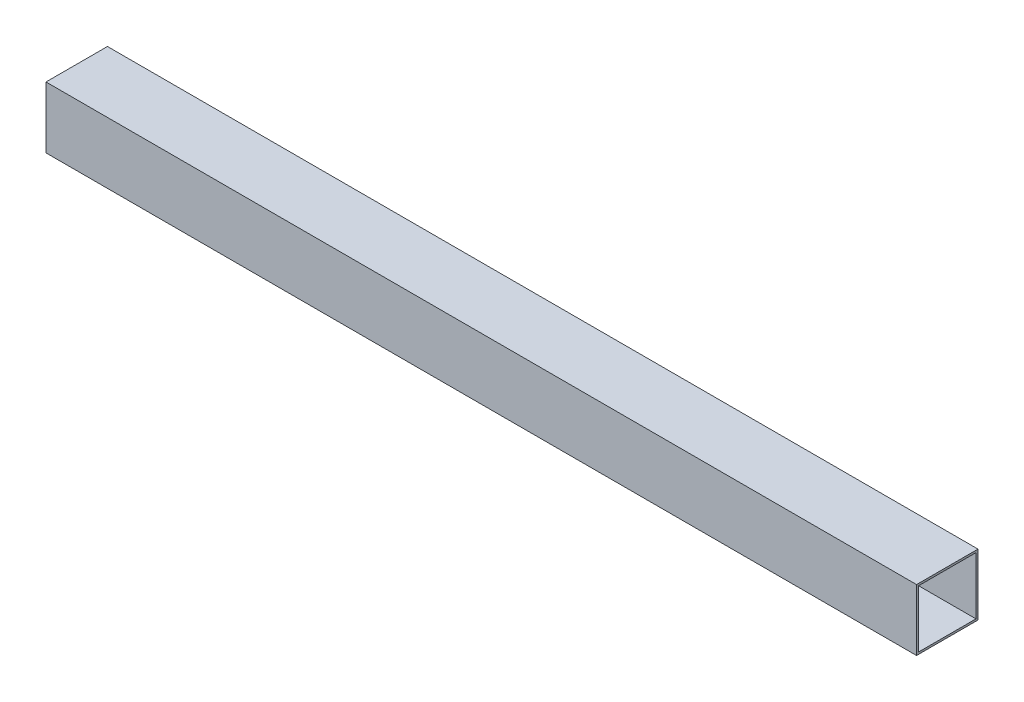
ISO-10303-21;
HEADER;
FILE_DESCRIPTION(('STEP AP214'),'2;1');
FILE_NAME('part.step','',(''),(''),'','','');
FILE_SCHEMA(('AUTOMOTIVE_DESIGN { 1 0 10303 214 1 1 1 1 }'));
ENDSEC;
DATA;
#1=APPLICATION_CONTEXT('core data for automotive mechanical design processes');
#2=APPLICATION_PROTOCOL_DEFINITION('international standard','automotive_design',2000,#1);
#3=PRODUCT_CONTEXT('',#1,'mechanical');
#4=PRODUCT('Part','Part','',(#3));
#5=PRODUCT_RELATED_PRODUCT_CATEGORY('part','',(#4));
#6=PRODUCT_DEFINITION_FORMATION('','',#4);
#7=PRODUCT_DEFINITION_CONTEXT('part definition',#1,'design');
#8=PRODUCT_DEFINITION('design','',#6,#7);
#9=PRODUCT_DEFINITION_SHAPE('','',#8);
#10=(LENGTH_UNIT() NAMED_UNIT(*) SI_UNIT(.MILLI.,.METRE.));
#11=(NAMED_UNIT(*) PLANE_ANGLE_UNIT() SI_UNIT($,.RADIAN.));
#12=(NAMED_UNIT(*) SI_UNIT($,.STERADIAN.) SOLID_ANGLE_UNIT());
#13=UNCERTAINTY_MEASURE_WITH_UNIT(LENGTH_MEASURE(1.E-05),#10,'distance_accuracy_value','');
#14=(GEOMETRIC_REPRESENTATION_CONTEXT(3) GLOBAL_UNCERTAINTY_ASSIGNED_CONTEXT((#13)) GLOBAL_UNIT_ASSIGNED_CONTEXT((#10,
#11,#12)) REPRESENTATION_CONTEXT('',''));
#15=CARTESIAN_POINT('',(0.,0.,0.));
#16=DIRECTION('',(0.,0.,1.));
#17=DIRECTION('',(1.,0.,0.));
#18=AXIS2_PLACEMENT_3D('',#15,#16,#17);
#19=CARTESIAN_POINT('',(1010.,2107.5,150.));
#20=DIRECTION('',(0.,1.,0.));
#21=DIRECTION('',(0.,0.,1.));
#22=AXIS2_PLACEMENT_3D('',#19,#20,#21);
#23=PLANE('',#22);
#24=DIRECTION('',(-1.,0.,0.));
#25=VECTOR('',#24,1.);
#26=CARTESIAN_POINT('',(4450.,2107.5,-150.));
#27=LINE('',#26,#25);
#28=CARTESIAN_POINT('',(4400.,2107.5,-150.));
#29=VERTEX_POINT('',#28);
#30=CARTESIAN_POINT('',(150.,2107.5,-150.));
#31=VERTEX_POINT('',#30);
#32=EDGE_CURVE('E139',#29,#31,#27,.T.);
#33=ORIENTED_EDGE('',*,*,#32,.T.);
#34=DIRECTION('',(0.,0.,1.));
#35=VECTOR('',#34,1.);
#36=CARTESIAN_POINT('',(150.,2107.5,150.));
#37=LINE('',#36,#35);
#38=CARTESIAN_POINT('',(150.,2107.5,150.));
#39=VERTEX_POINT('',#38);
#40=EDGE_CURVE('E132',#31,#39,#37,.T.);
#41=ORIENTED_EDGE('',*,*,#40,.T.);
#42=DIRECTION('',(-1.,0.,0.));
#43=VECTOR('',#42,1.);
#44=CARTESIAN_POINT('',(4450.,2107.5,150.));
#45=LINE('',#44,#43);
#46=CARTESIAN_POINT('',(4400.,2107.5,150.));
#47=VERTEX_POINT('',#46);
#48=EDGE_CURVE('E137',#47,#39,#45,.T.);
#49=ORIENTED_EDGE('',*,*,#48,.F.);
#50=DIRECTION('',(0.,0.,1.));
#51=VECTOR('',#50,1.);
#52=CARTESIAN_POINT('',(4400.,2107.5,150.));
#53=LINE('',#52,#51);
#54=EDGE_CURVE('E43',#29,#47,#53,.T.);
#55=ORIENTED_EDGE('',*,*,#54,.F.);
#56=EDGE_LOOP('',(#33,#41,#49,#55));
#57=FACE_BOUND('',#56,.T.);
#58=ADVANCED_FACE('F34',(#57),#23,.T.);
#59=CARTESIAN_POINT('',(160.,2347.5,150.));
#60=DIRECTION('',(0.,0.,-1.));
#61=DIRECTION('',(-1.,0.,0.));
#62=AXIS2_PLACEMENT_3D('',#59,#60,#61);
#63=PLANE('',#62);
#64=ORIENTED_EDGE('',*,*,#48,.T.);
#65=DIRECTION('',(0.,-1.,0.));
#66=VECTOR('',#65,1.);
#67=CARTESIAN_POINT('',(150.,1807.5,150.));
#68=LINE('',#67,#66);
#69=CARTESIAN_POINT('',(150.,1807.5,150.));
#70=VERTEX_POINT('',#69);
#71=EDGE_CURVE('E163',#39,#70,#68,.T.);
#72=ORIENTED_EDGE('',*,*,#71,.T.);
#73=DIRECTION('',(-1.,0.,0.));
#74=VECTOR('',#73,1.);
#75=CARTESIAN_POINT('',(4450.,1807.5,150.));
#76=LINE('',#75,#74);
#77=CARTESIAN_POINT('',(4400.,1807.5,150.));
#78=VERTEX_POINT('',#77);
#79=EDGE_CURVE('E51',#78,#70,#76,.T.);
#80=ORIENTED_EDGE('',*,*,#79,.F.);
#81=DIRECTION('',(0.,1.,0.));
#82=VECTOR('',#81,1.);
#83=CARTESIAN_POINT('',(4400.,2347.5,150.));
#84=LINE('',#83,#82);
#85=EDGE_CURVE('E150',#78,#47,#84,.T.);
#86=ORIENTED_EDGE('',*,*,#85,.T.);
#87=EDGE_LOOP('',(#64,#72,#80,#86));
#88=FACE_BOUND('',#87,.T.);
#89=ADVANCED_FACE('F36',(#88),#63,.F.);
#90=CARTESIAN_POINT('',(4450.,0.,-140.));
#91=DIRECTION('',(0.,0.,1.));
#92=DIRECTION('',(1.,0.,0.));
#93=AXIS2_PLACEMENT_3D('',#90,#91,#92);
#94=PLANE('',#93);
#95=DIRECTION('',(-1.,0.,0.));
#96=VECTOR('',#95,1.);
#97=CARTESIAN_POINT('',(4450.,1817.5,-140.));
#98=LINE('',#97,#96);
#99=CARTESIAN_POINT('',(4400.,1817.5,-140.));
#100=VERTEX_POINT('',#99);
#101=CARTESIAN_POINT('',(150.,1817.5,-140.));
#102=VERTEX_POINT('',#101);
#103=EDGE_CURVE('E102',#100,#102,#98,.T.);
#104=ORIENTED_EDGE('',*,*,#103,.F.);
#105=DIRECTION('',(0.,1.,0.));
#106=VECTOR('',#105,1.);
#107=CARTESIAN_POINT('',(4400.,0.,-140.));
#108=LINE('',#107,#106);
#109=CARTESIAN_POINT('',(4400.,2097.5,-140.));
#110=VERTEX_POINT('',#109);
#111=EDGE_CURVE('E140',#100,#110,#108,.T.);
#112=ORIENTED_EDGE('',*,*,#111,.T.);
#113=DIRECTION('',(-1.,0.,0.));
#114=VECTOR('',#113,1.);
#115=CARTESIAN_POINT('',(4450.,2097.5,-140.));
#116=LINE('',#115,#114);
#117=CARTESIAN_POINT('',(150.,2097.5,-140.));
#118=VERTEX_POINT('',#117);
#119=EDGE_CURVE('E118',#110,#118,#116,.T.);
#120=ORIENTED_EDGE('',*,*,#119,.T.);
#121=DIRECTION('',(0.,1.,0.));
#122=VECTOR('',#121,1.);
#123=CARTESIAN_POINT('',(150.,0.,-140.));
#124=LINE('',#123,#122);
#125=EDGE_CURVE('E116',#102,#118,#124,.T.);
#126=ORIENTED_EDGE('',*,*,#125,.F.);
#127=EDGE_LOOP('',(#104,#112,#120,#126));
#128=FACE_BOUND('',#127,.T.);
#129=ADVANCED_FACE('F117',(#128),#94,.T.);
#130=CARTESIAN_POINT('',(4450.,2097.5,3.10492372553502E-12));
#131=DIRECTION('',(0.,-1.,0.));
#132=DIRECTION('',(0.,0.,-1.));
#133=AXIS2_PLACEMENT_3D('',#130,#131,#132);
#134=PLANE('',#133);
#135=ORIENTED_EDGE('',*,*,#119,.F.);
#136=DIRECTION('',(0.,0.,1.));
#137=VECTOR('',#136,1.);
#138=CARTESIAN_POINT('',(4400.,2097.5,3.10492372553502E-12));
#139=LINE('',#138,#137);
#140=CARTESIAN_POINT('',(4400.,2097.5,140.));
#141=VERTEX_POINT('',#140);
#142=EDGE_CURVE('E144',#110,#141,#139,.T.);
#143=ORIENTED_EDGE('',*,*,#142,.T.);
#144=DIRECTION('',(-1.,0.,0.));
#145=VECTOR('',#144,1.);
#146=CARTESIAN_POINT('',(4450.,2097.5,140.));
#147=LINE('',#146,#145);
#148=CARTESIAN_POINT('',(150.,2097.5,140.));
#149=VERTEX_POINT('',#148);
#150=EDGE_CURVE('E384',#141,#149,#147,.T.);
#151=ORIENTED_EDGE('',*,*,#150,.T.);
#152=DIRECTION('',(0.,0.,1.));
#153=VECTOR('',#152,1.);
#154=CARTESIAN_POINT('',(150.,2097.5,3.10492372553502E-12));
#155=LINE('',#154,#153);
#156=EDGE_CURVE('E123',#118,#149,#155,.T.);
#157=ORIENTED_EDGE('',*,*,#156,.F.);
#158=EDGE_LOOP('',(#135,#143,#151,#157));
#159=FACE_BOUND('',#158,.T.);
#160=ADVANCED_FACE('F192',(#159),#134,.T.);
#161=CARTESIAN_POINT('',(4450.,0.,140.));
#162=DIRECTION('',(0.,0.,-1.));
#163=DIRECTION('',(-1.,0.,0.));
#164=AXIS2_PLACEMENT_3D('',#161,#162,#163);
#165=PLANE('',#164);
#166=ORIENTED_EDGE('',*,*,#150,.F.);
#167=DIRECTION('',(0.,-1.,0.));
#168=VECTOR('',#167,1.);
#169=CARTESIAN_POINT('',(4400.,0.,140.));
#170=LINE('',#169,#168);
#171=CARTESIAN_POINT('',(4400.,1817.5,140.));
#172=VERTEX_POINT('',#171);
#173=EDGE_CURVE('E122',#141,#172,#170,.T.);
#174=ORIENTED_EDGE('',*,*,#173,.T.);
#175=DIRECTION('',(-1.,0.,0.));
#176=VECTOR('',#175,1.);
#177=CARTESIAN_POINT('',(4450.,1817.5,140.));
#178=LINE('',#177,#176);
#179=CARTESIAN_POINT('',(150.,1817.5,140.));
#180=VERTEX_POINT('',#179);
#181=EDGE_CURVE('E113',#172,#180,#178,.T.);
#182=ORIENTED_EDGE('',*,*,#181,.T.);
#183=DIRECTION('',(0.,-1.,0.));
#184=VECTOR('',#183,1.);
#185=CARTESIAN_POINT('',(150.,0.,140.));
#186=LINE('',#185,#184);
#187=EDGE_CURVE('E127',#149,#180,#186,.T.);
#188=ORIENTED_EDGE('',*,*,#187,.F.);
#189=EDGE_LOOP('',(#166,#174,#182,#188));
#190=FACE_BOUND('',#189,.T.);
#191=ADVANCED_FACE('F195',(#190),#165,.T.);
#192=CARTESIAN_POINT('',(4450.,1817.5,0.));
#193=DIRECTION('',(0.,1.,0.));
#194=DIRECTION('',(0.,0.,1.));
#195=AXIS2_PLACEMENT_3D('',#192,#193,#194);
#196=PLANE('',#195);
#197=ORIENTED_EDGE('',*,*,#181,.F.);
#198=DIRECTION('',(0.,0.,-1.));
#199=VECTOR('',#198,1.);
#200=CARTESIAN_POINT('',(4400.,1817.5,0.));
#201=LINE('',#200,#199);
#202=EDGE_CURVE('E109',#172,#100,#201,.T.);
#203=ORIENTED_EDGE('',*,*,#202,.T.);
#204=ORIENTED_EDGE('',*,*,#103,.T.);
#205=DIRECTION('',(0.,0.,-1.));
#206=VECTOR('',#205,1.);
#207=CARTESIAN_POINT('',(150.,1817.5,0.));
#208=LINE('',#207,#206);
#209=EDGE_CURVE('E106',#180,#102,#208,.T.);
#210=ORIENTED_EDGE('',*,*,#209,.F.);
#211=EDGE_LOOP('',(#197,#203,#204,#210));
#212=FACE_BOUND('',#211,.T.);
#213=ADVANCED_FACE('F104',(#212),#196,.T.);
#214=CARTESIAN_POINT('',(150.,0.,0.));
#215=DIRECTION('',(1.,0.,0.));
#216=DIRECTION('',(0.,0.,-1.));
#217=AXIS2_PLACEMENT_3D('',#214,#215,#216);
#218=PLANE('',#217);
#219=DIRECTION('',(0.,1.,0.));
#220=VECTOR('',#219,1.);
#221=CARTESIAN_POINT('',(150.,1807.5,-150.));
#222=LINE('',#221,#220);
#223=CARTESIAN_POINT('',(150.,1807.5,-150.));
#224=VERTEX_POINT('',#223);
#225=EDGE_CURVE('E128',#224,#31,#222,.T.);
#226=ORIENTED_EDGE('',*,*,#225,.F.);
#227=DIRECTION('',(0.,0.,-1.));
#228=VECTOR('',#227,1.);
#229=CARTESIAN_POINT('',(150.,1807.5,150.));
#230=LINE('',#229,#228);
#231=EDGE_CURVE('E159',#70,#224,#230,.T.);
#232=ORIENTED_EDGE('',*,*,#231,.F.);
#233=ORIENTED_EDGE('',*,*,#71,.F.);
#234=ORIENTED_EDGE('',*,*,#40,.F.);
#235=EDGE_LOOP('',(#226,#232,#233,#234));
#236=FACE_BOUND('',#235,.T.);
#237=ORIENTED_EDGE('',*,*,#125,.T.);
#238=ORIENTED_EDGE('',*,*,#156,.T.);
#239=ORIENTED_EDGE('',*,*,#187,.T.);
#240=ORIENTED_EDGE('',*,*,#209,.T.);
#241=EDGE_LOOP('',(#237,#238,#239,#240));
#242=FACE_BOUND('',#241,.T.);
#243=ADVANCED_FACE('F125',(#236,#242),#218,.F.);
#244=CARTESIAN_POINT('',(4450.,1807.5,150.));
#245=DIRECTION('',(0.,1.,0.));
#246=DIRECTION('',(0.,0.,1.));
#247=AXIS2_PLACEMENT_3D('',#244,#245,#246);
#248=PLANE('',#247);
#249=DIRECTION('',(-1.,0.,0.));
#250=VECTOR('',#249,1.);
#251=CARTESIAN_POINT('',(4450.,1807.5,-150.));
#252=LINE('',#251,#250);
#253=CARTESIAN_POINT('',(4400.,1807.5,-150.));
#254=VERTEX_POINT('',#253);
#255=EDGE_CURVE('E59',#254,#224,#252,.T.);
#256=ORIENTED_EDGE('',*,*,#255,.F.);
#257=DIRECTION('',(0.,0.,-1.));
#258=VECTOR('',#257,1.);
#259=CARTESIAN_POINT('',(4400.,1807.5,150.));
#260=LINE('',#259,#258);
#261=EDGE_CURVE('E11',#78,#254,#260,.T.);
#262=ORIENTED_EDGE('',*,*,#261,.F.);
#263=ORIENTED_EDGE('',*,*,#79,.T.);
#264=ORIENTED_EDGE('',*,*,#231,.T.);
#265=EDGE_LOOP('',(#256,#262,#263,#264));
#266=FACE_BOUND('',#265,.T.);
#267=ADVANCED_FACE('F157',(#266),#248,.F.);
#268=CARTESIAN_POINT('',(4400.,0.,0.));
#269=DIRECTION('',(-1.,0.,0.));
#270=DIRECTION('',(0.,0.,1.));
#271=AXIS2_PLACEMENT_3D('',#268,#269,#270);
#272=PLANE('',#271);
#273=ORIENTED_EDGE('',*,*,#202,.F.);
#274=ORIENTED_EDGE('',*,*,#173,.F.);
#275=ORIENTED_EDGE('',*,*,#142,.F.);
#276=ORIENTED_EDGE('',*,*,#111,.F.);
#277=EDGE_LOOP('',(#273,#274,#275,#276));
#278=FACE_BOUND('',#277,.T.);
#279=ORIENTED_EDGE('',*,*,#261,.T.);
#280=DIRECTION('',(0.,-1.,0.));
#281=VECTOR('',#280,1.);
#282=CARTESIAN_POINT('',(4400.,2347.5,-150.));
#283=LINE('',#282,#281);
#284=EDGE_CURVE('E38',#29,#254,#283,.T.);
#285=ORIENTED_EDGE('',*,*,#284,.F.);
#286=ORIENTED_EDGE('',*,*,#54,.T.);
#287=ORIENTED_EDGE('',*,*,#85,.F.);
#288=EDGE_LOOP('',(#279,#285,#286,#287));
#289=FACE_BOUND('',#288,.T.);
#290=ADVANCED_FACE('F156',(#278,#289),#272,.F.);
#291=CARTESIAN_POINT('',(160.,2347.5,-150.));
#292=DIRECTION('',(0.,0.,1.));
#293=DIRECTION('',(1.,0.,0.));
#294=AXIS2_PLACEMENT_3D('',#291,#292,#293);
#295=PLANE('',#294);
#296=ORIENTED_EDGE('',*,*,#225,.T.);
#297=ORIENTED_EDGE('',*,*,#32,.F.);
#298=ORIENTED_EDGE('',*,*,#284,.T.);
#299=ORIENTED_EDGE('',*,*,#255,.T.);
#300=EDGE_LOOP('',(#296,#297,#298,#299));
#301=FACE_BOUND('',#300,.T.);
#302=ADVANCED_FACE('F154',(#301),#295,.F.);
#303=CLOSED_SHELL('',(#58,#89,#129,#160,#191,#213,#243,#267,#290,#302));
#304=MANIFOLD_SOLID_BREP('B2',#303);
#305=ADVANCED_BREP_SHAPE_REPRESENTATION('',(#18,#304),#14);
#306=SHAPE_DEFINITION_REPRESENTATION(#9,#305);
ENDSEC;
END-ISO-10303-21;
